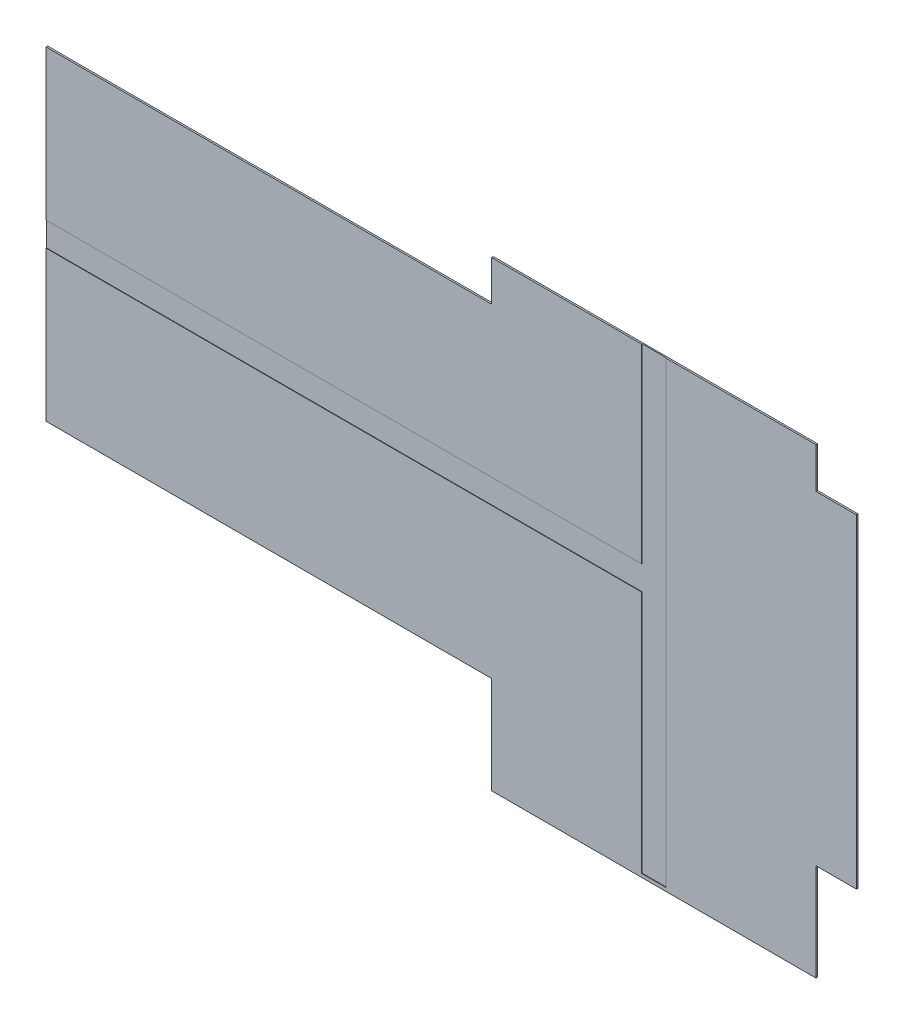
ISO-10303-21;
HEADER;
FILE_DESCRIPTION(('STEP AP214'),'2;1');
FILE_NAME('part.step','',(''),(''),'','','');
FILE_SCHEMA(('AUTOMOTIVE_DESIGN { 1 0 10303 214 1 1 1 1 }'));
ENDSEC;
DATA;
#1=APPLICATION_CONTEXT('core data for automotive mechanical design processes');
#2=APPLICATION_PROTOCOL_DEFINITION('international standard','automotive_design',2000,#1);
#3=PRODUCT_CONTEXT('',#1,'mechanical');
#4=PRODUCT('Part','Part','',(#3));
#5=PRODUCT_RELATED_PRODUCT_CATEGORY('part','',(#4));
#6=PRODUCT_DEFINITION_FORMATION('','',#4);
#7=PRODUCT_DEFINITION_CONTEXT('part definition',#1,'design');
#8=PRODUCT_DEFINITION('design','',#6,#7);
#9=PRODUCT_DEFINITION_SHAPE('','',#8);
#10=(LENGTH_UNIT() NAMED_UNIT(*) SI_UNIT(.MILLI.,.METRE.));
#11=(NAMED_UNIT(*) PLANE_ANGLE_UNIT() SI_UNIT($,.RADIAN.));
#12=(NAMED_UNIT(*) SI_UNIT($,.STERADIAN.) SOLID_ANGLE_UNIT());
#13=UNCERTAINTY_MEASURE_WITH_UNIT(LENGTH_MEASURE(1.E-05),#10,'distance_accuracy_value','');
#14=(GEOMETRIC_REPRESENTATION_CONTEXT(3) GLOBAL_UNCERTAINTY_ASSIGNED_CONTEXT((#13)) GLOBAL_UNIT_ASSIGNED_CONTEXT((#10,
#11,#12)) REPRESENTATION_CONTEXT('',''));
#15=CARTESIAN_POINT('',(0.,0.,0.));
#16=DIRECTION('',(0.,0.,1.));
#17=DIRECTION('',(1.,0.,0.));
#18=AXIS2_PLACEMENT_3D('',#15,#16,#17);
#19=CARTESIAN_POINT('',(0.,252.798507462687,2.));
#20=DIRECTION('',(0.,1.,0.));
#21=DIRECTION('',(0.,0.,1.));
#22=AXIS2_PLACEMENT_3D('',#19,#20,#21);
#23=PLANE('',#22);
#24=DIRECTION('',(1.,0.,0.));
#25=VECTOR('',#24,1.);
#26=CARTESIAN_POINT('',(0.,252.798507462687,1.5));
#27=LINE('',#26,#25);
#28=CARTESIAN_POINT('',(166.097732076766,252.798507462687,1.5));
#29=VERTEX_POINT('',#28);
#30=CARTESIAN_POINT('',(196.097732076766,252.798507462687,1.5));
#31=VERTEX_POINT('',#30);
#32=EDGE_CURVE('E197',#29,#31,#27,.T.);
#33=ORIENTED_EDGE('',*,*,#32,.T.);
#34=DIRECTION('',(0.,0.,1.));
#35=VECTOR('',#34,1.);
#36=CARTESIAN_POINT('',(196.097732076766,252.798507462687,2.));
#37=LINE('',#36,#35);
#38=CARTESIAN_POINT('',(196.097732076766,252.798507462687,2.));
#39=VERTEX_POINT('',#38);
#40=EDGE_CURVE('E262',#31,#39,#37,.T.);
#41=ORIENTED_EDGE('',*,*,#40,.T.);
#42=DIRECTION('',(1.,0.,0.));
#43=VECTOR('',#42,1.);
#44=CARTESIAN_POINT('',(0.,252.798507462687,2.));
#45=LINE('',#44,#43);
#46=CARTESIAN_POINT('',(381.097732076766,252.798507462687,2.));
#47=VERTEX_POINT('',#46);
#48=EDGE_CURVE('E254',#39,#47,#45,.T.);
#49=ORIENTED_EDGE('',*,*,#48,.T.);
#50=DIRECTION('',(0.,0.,-1.));
#51=VECTOR('',#50,1.);
#52=CARTESIAN_POINT('',(381.097732076766,252.798507462687,2.));
#53=LINE('',#52,#51);
#54=CARTESIAN_POINT('',(381.097732076766,252.798507462687,0.));
#55=VERTEX_POINT('',#54);
#56=EDGE_CURVE('E235',#47,#55,#53,.T.);
#57=ORIENTED_EDGE('',*,*,#56,.T.);
#58=DIRECTION('',(1.,0.,0.));
#59=VECTOR('',#58,1.);
#60=CARTESIAN_POINT('',(0.,252.798507462687,0.));
#61=LINE('',#60,#59);
#62=CARTESIAN_POINT('',(-18.9022679232337,252.798507462687,0.));
#63=VERTEX_POINT('',#62);
#64=EDGE_CURVE('E209',#63,#55,#61,.T.);
#65=ORIENTED_EDGE('',*,*,#64,.F.);
#66=DIRECTION('',(0.,0.,-1.));
#67=VECTOR('',#66,1.);
#68=CARTESIAN_POINT('',(-18.9022679232337,252.798507462687,2.));
#69=LINE('',#68,#67);
#70=CARTESIAN_POINT('',(-18.9022679232337,252.798507462687,2.));
#71=VERTEX_POINT('',#70);
#72=EDGE_CURVE('E233',#71,#63,#69,.T.);
#73=ORIENTED_EDGE('',*,*,#72,.F.);
#74=CARTESIAN_POINT('',(166.097732076766,252.798507462687,2.));
#75=VERTEX_POINT('',#74);
#76=EDGE_CURVE('E292',#71,#75,#45,.T.);
#77=ORIENTED_EDGE('',*,*,#76,.T.);
#78=DIRECTION('',(0.,0.,1.));
#79=VECTOR('',#78,1.);
#80=CARTESIAN_POINT('',(166.097732076766,252.798507462687,2.));
#81=LINE('',#80,#79);
#82=EDGE_CURVE('E272',#29,#75,#81,.T.);
#83=ORIENTED_EDGE('',*,*,#82,.F.);
#84=EDGE_LOOP('',(#33,#41,#49,#57,#65,#73,#77,#83));
#85=FACE_BOUND('',#84,.T.);
#86=ADVANCED_FACE('F61',(#85),#23,.T.);
#87=CARTESIAN_POINT('',(0.,0.,2.));
#88=DIRECTION('',(0.,0.,1.));
#89=DIRECTION('',(1.,0.,0.));
#90=AXIS2_PLACEMENT_3D('',#87,#88,#89);
#91=PLANE('',#90);
#92=DIRECTION('',(0.,-1.,0.));
#93=VECTOR('',#92,1.);
#94=CARTESIAN_POINT('',(-568.902267923234,-1.10808490633306E-13,2.));
#95=LINE('',#94,#93);
#96=CARTESIAN_POINT('',(-568.902267923234,202.798507462687,2.));
#97=VERTEX_POINT('',#96);
#98=CARTESIAN_POINT('',(-568.902267923234,17.7985074626865,2.));
#99=VERTEX_POINT('',#98);
#100=EDGE_CURVE('E175',#97,#99,#95,.T.);
#101=ORIENTED_EDGE('',*,*,#100,.T.);
#102=DIRECTION('',(1.,0.,0.));
#103=VECTOR('',#102,1.);
#104=CARTESIAN_POINT('',(0.,17.7985074626865,2.));
#105=LINE('',#104,#103);
#106=CARTESIAN_POINT('',(166.097732076766,17.7985074626865,2.));
#107=VERTEX_POINT('',#106);
#108=EDGE_CURVE('E309',#99,#107,#105,.T.);
#109=ORIENTED_EDGE('',*,*,#108,.T.);
#110=DIRECTION('',(0.,-1.,0.));
#111=VECTOR('',#110,1.);
#112=CARTESIAN_POINT('',(166.097732076766,0.,2.));
#113=LINE('',#112,#111);
#114=EDGE_CURVE('E12',#75,#107,#113,.T.);
#115=ORIENTED_EDGE('',*,*,#114,.F.);
#116=ORIENTED_EDGE('',*,*,#76,.F.);
#117=DIRECTION('',(0.,-1.,0.));
#118=VECTOR('',#117,1.);
#119=CARTESIAN_POINT('',(-18.9022679232336,0.,2.));
#120=LINE('',#119,#118);
#121=CARTESIAN_POINT('',(-18.9022679232337,202.798507462687,2.));
#122=VERTEX_POINT('',#121);
#123=EDGE_CURVE('E295',#71,#122,#120,.T.);
#124=ORIENTED_EDGE('',*,*,#123,.T.);
#125=DIRECTION('',(1.,0.,0.));
#126=VECTOR('',#125,1.);
#127=CARTESIAN_POINT('',(0.,202.798507462687,2.));
#128=LINE('',#127,#126);
#129=EDGE_CURVE('E297',#97,#122,#128,.T.);
#130=ORIENTED_EDGE('',*,*,#129,.F.);
#131=EDGE_LOOP('',(#101,#109,#115,#116,#124,#130));
#132=FACE_BOUND('',#131,.T.);
#133=ADVANCED_FACE('F305',(#132),#91,.T.);
#134=CARTESIAN_POINT('',(381.097732076766,1.7629311532669E-13,2.));
#135=DIRECTION('',(1.,0.,0.));
#136=DIRECTION('',(0.,1.,0.));
#137=AXIS2_PLACEMENT_3D('',#134,#135,#136);
#138=PLANE('',#137);
#139=DIRECTION('',(0.,-1.,0.));
#140=VECTOR('',#139,1.);
#141=CARTESIAN_POINT('',(381.097732076766,1.7629311532669E-13,0.));
#142=LINE('',#141,#140);
#143=CARTESIAN_POINT('',(381.097732076766,-197.201492537313,0.));
#144=VERTEX_POINT('',#143);
#145=CARTESIAN_POINT('',(381.097732076766,-317.201492537313,0.));
#146=VERTEX_POINT('',#145);
#147=EDGE_CURVE('E193',#144,#146,#142,.T.);
#148=ORIENTED_EDGE('',*,*,#147,.F.);
#149=DIRECTION('',(0.,0.,-1.));
#150=VECTOR('',#149,1.);
#151=CARTESIAN_POINT('',(381.097732076766,-197.201492537313,2.));
#152=LINE('',#151,#150);
#153=CARTESIAN_POINT('',(381.097732076766,-197.201492537313,2.));
#154=VERTEX_POINT('',#153);
#155=EDGE_CURVE('E136',#154,#144,#152,.T.);
#156=ORIENTED_EDGE('',*,*,#155,.F.);
#157=DIRECTION('',(0.,-1.,0.));
#158=VECTOR('',#157,1.);
#159=CARTESIAN_POINT('',(381.097732076766,1.7629311532669E-13,2.));
#160=LINE('',#159,#158);
#161=CARTESIAN_POINT('',(381.097732076766,-317.201492537313,2.));
#162=VERTEX_POINT('',#161);
#163=EDGE_CURVE('E225',#154,#162,#160,.T.);
#164=ORIENTED_EDGE('',*,*,#163,.T.);
#165=DIRECTION('',(0.,0.,-1.));
#166=VECTOR('',#165,1.);
#167=CARTESIAN_POINT('',(381.097732076766,-317.201492537313,2.));
#168=LINE('',#167,#166);
#169=EDGE_CURVE('E131',#162,#146,#168,.T.);
#170=ORIENTED_EDGE('',*,*,#169,.T.);
#171=EDGE_LOOP('',(#148,#156,#164,#170));
#172=FACE_BOUND('',#171,.T.);
#173=ADVANCED_FACE('F63',(#172),#138,.T.);
#174=CARTESIAN_POINT('',(0.,-197.201492537313,2.));
#175=DIRECTION('',(0.,1.,0.));
#176=DIRECTION('',(0.,0.,1.));
#177=AXIS2_PLACEMENT_3D('',#174,#175,#176);
#178=PLANE('',#177);
#179=DIRECTION('',(1.,0.,0.));
#180=VECTOR('',#179,1.);
#181=CARTESIAN_POINT('',(0.,-197.201492537313,0.));
#182=LINE('',#181,#180);
#183=CARTESIAN_POINT('',(431.097732076766,-197.201492537313,0.));
#184=VERTEX_POINT('',#183);
#185=EDGE_CURVE('E196',#144,#184,#182,.T.);
#186=ORIENTED_EDGE('',*,*,#185,.T.);
#187=DIRECTION('',(0.,0.,-1.));
#188=VECTOR('',#187,1.);
#189=CARTESIAN_POINT('',(431.097732076766,-197.201492537313,2.));
#190=LINE('',#189,#188);
#191=CARTESIAN_POINT('',(431.097732076766,-197.201492537313,2.));
#192=VERTEX_POINT('',#191);
#193=EDGE_CURVE('E241',#192,#184,#190,.T.);
#194=ORIENTED_EDGE('',*,*,#193,.F.);
#195=DIRECTION('',(1.,0.,0.));
#196=VECTOR('',#195,1.);
#197=CARTESIAN_POINT('',(0.,-197.201492537313,2.));
#198=LINE('',#197,#196);
#199=EDGE_CURVE('E281',#154,#192,#198,.T.);
#200=ORIENTED_EDGE('',*,*,#199,.F.);
#201=ORIENTED_EDGE('',*,*,#155,.T.);
#202=EDGE_LOOP('',(#186,#194,#200,#201));
#203=FACE_BOUND('',#202,.T.);
#204=ADVANCED_FACE('F377',(#203),#178,.F.);
#205=CARTESIAN_POINT('',(431.097732076766,0.,2.));
#206=DIRECTION('',(1.,0.,0.));
#207=DIRECTION('',(0.,1.,0.));
#208=AXIS2_PLACEMENT_3D('',#205,#206,#207);
#209=PLANE('',#208);
#210=DIRECTION('',(0.,-1.,0.));
#211=VECTOR('',#210,1.);
#212=CARTESIAN_POINT('',(431.097732076766,0.,0.));
#213=LINE('',#212,#211);
#214=CARTESIAN_POINT('',(431.097732076766,202.798507462687,0.));
#215=VERTEX_POINT('',#214);
#216=EDGE_CURVE('E200',#215,#184,#213,.T.);
#217=ORIENTED_EDGE('',*,*,#216,.F.);
#218=DIRECTION('',(0.,0.,-1.));
#219=VECTOR('',#218,1.);
#220=CARTESIAN_POINT('',(431.097732076766,202.798507462687,2.));
#221=LINE('',#220,#219);
#222=CARTESIAN_POINT('',(431.097732076766,202.798507462687,2.));
#223=VERTEX_POINT('',#222);
#224=EDGE_CURVE('E239',#223,#215,#221,.T.);
#225=ORIENTED_EDGE('',*,*,#224,.F.);
#226=DIRECTION('',(0.,-1.,0.));
#227=VECTOR('',#226,1.);
#228=CARTESIAN_POINT('',(431.097732076766,0.,2.));
#229=LINE('',#228,#227);
#230=EDGE_CURVE('E283',#223,#192,#229,.T.);
#231=ORIENTED_EDGE('',*,*,#230,.T.);
#232=ORIENTED_EDGE('',*,*,#193,.T.);
#233=EDGE_LOOP('',(#217,#225,#231,#232));
#234=FACE_BOUND('',#233,.T.);
#235=ADVANCED_FACE('F380',(#234),#209,.T.);
#236=CARTESIAN_POINT('',(0.,202.798507462687,2.));
#237=DIRECTION('',(0.,1.,0.));
#238=DIRECTION('',(0.,0.,1.));
#239=AXIS2_PLACEMENT_3D('',#236,#237,#238);
#240=PLANE('',#239);
#241=DIRECTION('',(1.,0.,0.));
#242=VECTOR('',#241,1.);
#243=CARTESIAN_POINT('',(0.,202.798507462687,0.));
#244=LINE('',#243,#242);
#245=CARTESIAN_POINT('',(381.097732076766,202.798507462687,0.));
#246=VERTEX_POINT('',#245);
#247=EDGE_CURVE('E203',#246,#215,#244,.T.);
#248=ORIENTED_EDGE('',*,*,#247,.F.);
#249=DIRECTION('',(0.,0.,-1.));
#250=VECTOR('',#249,1.);
#251=CARTESIAN_POINT('',(381.097732076766,202.798507462687,2.));
#252=LINE('',#251,#250);
#253=CARTESIAN_POINT('',(381.097732076766,202.798507462687,2.));
#254=VERTEX_POINT('',#253);
#255=EDGE_CURVE('E237',#254,#246,#252,.T.);
#256=ORIENTED_EDGE('',*,*,#255,.F.);
#257=DIRECTION('',(1.,0.,0.));
#258=VECTOR('',#257,1.);
#259=CARTESIAN_POINT('',(0.,202.798507462687,2.));
#260=LINE('',#259,#258);
#261=EDGE_CURVE('E286',#254,#223,#260,.T.);
#262=ORIENTED_EDGE('',*,*,#261,.T.);
#263=ORIENTED_EDGE('',*,*,#224,.T.);
#264=EDGE_LOOP('',(#248,#256,#262,#263));
#265=FACE_BOUND('',#264,.T.);
#266=ADVANCED_FACE('F383',(#265),#240,.T.);
#267=CARTESIAN_POINT('',(381.097732076766,0.,2.));
#268=DIRECTION('',(1.,0.,0.));
#269=DIRECTION('',(0.,0.,-1.));
#270=AXIS2_PLACEMENT_3D('',#267,#268,#269);
#271=PLANE('',#270);
#272=DIRECTION('',(0.,-1.,0.));
#273=VECTOR('',#272,1.);
#274=CARTESIAN_POINT('',(381.097732076766,0.,0.));
#275=LINE('',#274,#273);
#276=EDGE_CURVE('E206',#55,#246,#275,.T.);
#277=ORIENTED_EDGE('',*,*,#276,.F.);
#278=ORIENTED_EDGE('',*,*,#56,.F.);
#279=DIRECTION('',(0.,-1.,0.));
#280=VECTOR('',#279,1.);
#281=CARTESIAN_POINT('',(381.097732076766,0.,2.));
#282=LINE('',#281,#280);
#283=EDGE_CURVE('E289',#47,#254,#282,.T.);
#284=ORIENTED_EDGE('',*,*,#283,.T.);
#285=ORIENTED_EDGE('',*,*,#255,.T.);
#286=EDGE_LOOP('',(#277,#278,#284,#285));
#287=FACE_BOUND('',#286,.T.);
#288=ADVANCED_FACE('F386',(#287),#271,.T.);
#289=CARTESIAN_POINT('',(-18.9022679232336,0.,2.));
#290=DIRECTION('',(1.,0.,0.));
#291=DIRECTION('',(0.,1.,0.));
#292=AXIS2_PLACEMENT_3D('',#289,#290,#291);
#293=PLANE('',#292);
#294=DIRECTION('',(0.,-1.,0.));
#295=VECTOR('',#294,1.);
#296=CARTESIAN_POINT('',(-18.9022679232336,0.,0.));
#297=LINE('',#296,#295);
#298=CARTESIAN_POINT('',(-18.9022679232337,202.798507462687,0.));
#299=VERTEX_POINT('',#298);
#300=EDGE_CURVE('E212',#63,#299,#297,.T.);
#301=ORIENTED_EDGE('',*,*,#300,.T.);
#302=DIRECTION('',(0.,0.,-1.));
#303=VECTOR('',#302,1.);
#304=CARTESIAN_POINT('',(-18.9022679232337,202.798507462687,2.));
#305=LINE('',#304,#303);
#306=EDGE_CURVE('E231',#122,#299,#305,.T.);
#307=ORIENTED_EDGE('',*,*,#306,.F.);
#308=ORIENTED_EDGE('',*,*,#123,.F.);
#309=ORIENTED_EDGE('',*,*,#72,.T.);
#310=EDGE_LOOP('',(#301,#307,#308,#309));
#311=FACE_BOUND('',#310,.T.);
#312=ADVANCED_FACE('F392',(#311),#293,.F.);
#313=CARTESIAN_POINT('',(0.,202.798507462687,2.));
#314=DIRECTION('',(0.,1.,0.));
#315=DIRECTION('',(0.,0.,1.));
#316=AXIS2_PLACEMENT_3D('',#313,#314,#315);
#317=PLANE('',#316);
#318=DIRECTION('',(1.,0.,0.));
#319=VECTOR('',#318,1.);
#320=CARTESIAN_POINT('',(0.,202.798507462687,0.));
#321=LINE('',#320,#319);
#322=CARTESIAN_POINT('',(-568.902267923234,202.798507462687,0.));
#323=VERTEX_POINT('',#322);
#324=EDGE_CURVE('E215',#323,#299,#321,.T.);
#325=ORIENTED_EDGE('',*,*,#324,.F.);
#326=DIRECTION('',(0.,0.,-1.));
#327=VECTOR('',#326,1.);
#328=CARTESIAN_POINT('',(-568.902267923234,202.798507462687,2.));
#329=LINE('',#328,#327);
#330=EDGE_CURVE('E229',#97,#323,#329,.T.);
#331=ORIENTED_EDGE('',*,*,#330,.F.);
#332=ORIENTED_EDGE('',*,*,#129,.T.);
#333=ORIENTED_EDGE('',*,*,#306,.T.);
#334=EDGE_LOOP('',(#325,#331,#332,#333));
#335=FACE_BOUND('',#334,.T.);
#336=ADVANCED_FACE('F553',(#335),#317,.T.);
#337=CARTESIAN_POINT('',(-568.902267923234,-1.10808490633306E-13,2.));
#338=DIRECTION('',(1.,0.,0.));
#339=DIRECTION('',(0.,1.,0.));
#340=AXIS2_PLACEMENT_3D('',#337,#338,#339);
#341=PLANE('',#340);
#342=CARTESIAN_POINT('',(-568.902267923234,-12.2014925373135,2.));
#343=VERTEX_POINT('',#342);
#344=CARTESIAN_POINT('',(-568.902267923234,-197.201492537313,2.));
#345=VERTEX_POINT('',#344);
#346=EDGE_CURVE('E171',#343,#345,#95,.T.);
#347=ORIENTED_EDGE('',*,*,#346,.F.);
#348=DIRECTION('',(0.,0.,1.));
#349=VECTOR('',#348,1.);
#350=CARTESIAN_POINT('',(-568.902267923234,-12.2014925373135,1.5));
#351=LINE('',#350,#349);
#352=CARTESIAN_POINT('',(-568.902267923234,-12.2014925373135,1.5));
#353=VERTEX_POINT('',#352);
#354=EDGE_CURVE('E326',#353,#343,#351,.T.);
#355=ORIENTED_EDGE('',*,*,#354,.F.);
#356=DIRECTION('',(0.,-1.,0.));
#357=VECTOR('',#356,1.);
#358=CARTESIAN_POINT('',(-568.902267923234,-1.10808490633306E-13,1.5));
#359=LINE('',#358,#357);
#360=CARTESIAN_POINT('',(-568.902267923234,17.7985074626865,1.5));
#361=VERTEX_POINT('',#360);
#362=EDGE_CURVE('E322',#361,#353,#359,.T.);
#363=ORIENTED_EDGE('',*,*,#362,.F.);
#364=DIRECTION('',(0.,0.,1.));
#365=VECTOR('',#364,1.);
#366=CARTESIAN_POINT('',(-568.902267923234,17.7985074626865,1.5));
#367=LINE('',#366,#365);
#368=EDGE_CURVE('E318',#361,#99,#367,.T.);
#369=ORIENTED_EDGE('',*,*,#368,.T.);
#370=ORIENTED_EDGE('',*,*,#100,.F.);
#371=ORIENTED_EDGE('',*,*,#330,.T.);
#372=DIRECTION('',(0.,-1.,0.));
#373=VECTOR('',#372,1.);
#374=CARTESIAN_POINT('',(-568.902267923234,-1.10808490633306E-13,0.));
#375=LINE('',#374,#373);
#376=CARTESIAN_POINT('',(-568.902267923234,-197.201492537313,0.));
#377=VERTEX_POINT('',#376);
#378=EDGE_CURVE('E218',#323,#377,#375,.T.);
#379=ORIENTED_EDGE('',*,*,#378,.T.);
#380=DIRECTION('',(0.,0.,-1.));
#381=VECTOR('',#380,1.);
#382=CARTESIAN_POINT('',(-568.902267923234,-197.201492537313,2.));
#383=LINE('',#382,#381);
#384=EDGE_CURVE('E185',#345,#377,#383,.T.);
#385=ORIENTED_EDGE('',*,*,#384,.F.);
#386=EDGE_LOOP('',(#347,#355,#363,#369,#370,#371,#379,#385));
#387=FACE_BOUND('',#386,.T.);
#388=ADVANCED_FACE('F314',(#387),#341,.F.);
#389=CARTESIAN_POINT('',(0.,-197.201492537313,2.));
#390=DIRECTION('',(0.,1.,0.));
#391=DIRECTION('',(0.,0.,1.));
#392=AXIS2_PLACEMENT_3D('',#389,#390,#391);
#393=PLANE('',#392);
#394=DIRECTION('',(1.,0.,0.));
#395=VECTOR('',#394,1.);
#396=CARTESIAN_POINT('',(0.,-197.201492537313,0.));
#397=LINE('',#396,#395);
#398=CARTESIAN_POINT('',(-18.9022679232336,-197.201492537313,0.));
#399=VERTEX_POINT('',#398);
#400=EDGE_CURVE('E181',#377,#399,#397,.T.);
#401=ORIENTED_EDGE('',*,*,#400,.T.);
#402=DIRECTION('',(0.,0.,-1.));
#403=VECTOR('',#402,1.);
#404=CARTESIAN_POINT('',(-18.9022679232336,-197.201492537313,2.));
#405=LINE('',#404,#403);
#406=CARTESIAN_POINT('',(-18.9022679232336,-197.201492537313,2.));
#407=VERTEX_POINT('',#406);
#408=EDGE_CURVE('E178',#407,#399,#405,.T.);
#409=ORIENTED_EDGE('',*,*,#408,.F.);
#410=DIRECTION('',(1.,0.,0.));
#411=VECTOR('',#410,1.);
#412=CARTESIAN_POINT('',(0.,-197.201492537313,2.));
#413=LINE('',#412,#411);
#414=EDGE_CURVE('E165',#345,#407,#413,.T.);
#415=ORIENTED_EDGE('',*,*,#414,.F.);
#416=ORIENTED_EDGE('',*,*,#384,.T.);
#417=EDGE_LOOP('',(#401,#409,#415,#416));
#418=FACE_BOUND('',#417,.T.);
#419=ADVANCED_FACE('F179',(#418),#393,.F.);
#420=CARTESIAN_POINT('',(-18.9022679232335,0.,2.));
#421=DIRECTION('',(-1.,0.,0.));
#422=DIRECTION('',(0.,-1.,0.));
#423=AXIS2_PLACEMENT_3D('',#420,#421,#422);
#424=PLANE('',#423);
#425=DIRECTION('',(0.,1.,0.));
#426=VECTOR('',#425,1.);
#427=CARTESIAN_POINT('',(-18.9022679232335,0.,0.));
#428=LINE('',#427,#426);
#429=CARTESIAN_POINT('',(-18.9022679232336,-317.201492537313,0.));
#430=VERTEX_POINT('',#429);
#431=EDGE_CURVE('E221',#430,#399,#428,.T.);
#432=ORIENTED_EDGE('',*,*,#431,.F.);
#433=DIRECTION('',(0.,0.,-1.));
#434=VECTOR('',#433,1.);
#435=CARTESIAN_POINT('',(-18.9022679232336,-317.201492537313,2.));
#436=LINE('',#435,#434);
#437=CARTESIAN_POINT('',(-18.9022679232336,-317.201492537313,2.));
#438=VERTEX_POINT('',#437);
#439=EDGE_CURVE('E186',#438,#430,#436,.T.);
#440=ORIENTED_EDGE('',*,*,#439,.F.);
#441=DIRECTION('',(0.,1.,0.));
#442=VECTOR('',#441,1.);
#443=CARTESIAN_POINT('',(-18.9022679232335,0.,2.));
#444=LINE('',#443,#442);
#445=EDGE_CURVE('E169',#438,#407,#444,.T.);
#446=ORIENTED_EDGE('',*,*,#445,.T.);
#447=ORIENTED_EDGE('',*,*,#408,.T.);
#448=EDGE_LOOP('',(#432,#440,#446,#447));
#449=FACE_BOUND('',#448,.T.);
#450=ADVANCED_FACE('F188',(#449),#424,.T.);
#451=CARTESIAN_POINT('',(0.,-317.201492537313,2.));
#452=DIRECTION('',(0.,1.,0.));
#453=DIRECTION('',(0.,0.,1.));
#454=AXIS2_PLACEMENT_3D('',#451,#452,#453);
#455=PLANE('',#454);
#456=DIRECTION('',(1.,0.,0.));
#457=VECTOR('',#456,1.);
#458=CARTESIAN_POINT('',(0.,-317.201492537313,0.));
#459=LINE('',#458,#457);
#460=EDGE_CURVE('E223',#430,#146,#459,.T.);
#461=ORIENTED_EDGE('',*,*,#460,.T.);
#462=ORIENTED_EDGE('',*,*,#169,.F.);
#463=DIRECTION('',(1.,0.,0.));
#464=VECTOR('',#463,1.);
#465=CARTESIAN_POINT('',(0.,-317.201492537313,2.));
#466=LINE('',#465,#464);
#467=EDGE_CURVE('E85',#438,#162,#466,.T.);
#468=ORIENTED_EDGE('',*,*,#467,.F.);
#469=ORIENTED_EDGE('',*,*,#439,.T.);
#470=EDGE_LOOP('',(#461,#462,#468,#469));
#471=FACE_BOUND('',#470,.T.);
#472=ADVANCED_FACE('F372',(#471),#455,.F.);
#473=DIRECTION('',(1.,0.,0.));
#474=VECTOR('',#473,1.);
#475=CARTESIAN_POINT('',(0.,-12.2014925373135,2.));
#476=LINE('',#475,#474);
#477=CARTESIAN_POINT('',(166.097732076766,-12.2014925373135,2.));
#478=VERTEX_POINT('',#477);
#479=EDGE_CURVE('E76',#343,#478,#476,.T.);
#480=ORIENTED_EDGE('',*,*,#479,.F.);
#481=ORIENTED_EDGE('',*,*,#346,.T.);
#482=ORIENTED_EDGE('',*,*,#414,.T.);
#483=ORIENTED_EDGE('',*,*,#445,.F.);
#484=ORIENTED_EDGE('',*,*,#467,.T.);
#485=ORIENTED_EDGE('',*,*,#163,.F.);
#486=ORIENTED_EDGE('',*,*,#199,.T.);
#487=ORIENTED_EDGE('',*,*,#230,.F.);
#488=ORIENTED_EDGE('',*,*,#261,.F.);
#489=ORIENTED_EDGE('',*,*,#283,.F.);
#490=ORIENTED_EDGE('',*,*,#48,.F.);
#491=DIRECTION('',(0.,-1.,0.));
#492=VECTOR('',#491,1.);
#493=CARTESIAN_POINT('',(196.097732076766,0.,2.));
#494=LINE('',#493,#492);
#495=CARTESIAN_POINT('',(196.097732076766,-312.921679908609,2.));
#496=VERTEX_POINT('',#495);
#497=EDGE_CURVE('E69',#39,#496,#494,.T.);
#498=ORIENTED_EDGE('',*,*,#497,.T.);
#499=DIRECTION('',(1.,0.,0.));
#500=VECTOR('',#499,1.);
#501=CARTESIAN_POINT('',(166.097732076766,-312.921679908609,2.));
#502=LINE('',#501,#500);
#503=CARTESIAN_POINT('',(166.097732076766,-312.921679908609,2.));
#504=VERTEX_POINT('',#503);
#505=EDGE_CURVE('E251',#504,#496,#502,.T.);
#506=ORIENTED_EDGE('',*,*,#505,.F.);
#507=DIRECTION('',(0.,-1.,0.));
#508=VECTOR('',#507,1.);
#509=CARTESIAN_POINT('',(166.097732076766,253.906798238422,2.));
#510=LINE('',#509,#508);
#511=EDGE_CURVE('E338',#478,#504,#510,.T.);
#512=ORIENTED_EDGE('',*,*,#511,.F.);
#513=EDGE_LOOP('',(#480,#481,#482,#483,#484,#485,#486,#487,#488,#489,#490,#498,#506,#512));
#514=FACE_BOUND('',#513,.T.);
#515=ADVANCED_FACE('F167',(#514),#91,.T.);
#516=CARTESIAN_POINT('',(0.,0.,0.));
#517=DIRECTION('',(0.,0.,1.));
#518=DIRECTION('',(1.,0.,0.));
#519=AXIS2_PLACEMENT_3D('',#516,#517,#518);
#520=PLANE('',#519);
#521=ORIENTED_EDGE('',*,*,#147,.T.);
#522=ORIENTED_EDGE('',*,*,#460,.F.);
#523=ORIENTED_EDGE('',*,*,#431,.T.);
#524=ORIENTED_EDGE('',*,*,#400,.F.);
#525=ORIENTED_EDGE('',*,*,#378,.F.);
#526=ORIENTED_EDGE('',*,*,#324,.T.);
#527=ORIENTED_EDGE('',*,*,#300,.F.);
#528=ORIENTED_EDGE('',*,*,#64,.T.);
#529=ORIENTED_EDGE('',*,*,#276,.T.);
#530=ORIENTED_EDGE('',*,*,#247,.T.);
#531=ORIENTED_EDGE('',*,*,#216,.T.);
#532=ORIENTED_EDGE('',*,*,#185,.F.);
#533=EDGE_LOOP('',(#521,#522,#523,#524,#525,#526,#527,#528,#529,#530,#531,#532));
#534=FACE_BOUND('',#533,.T.);
#535=ADVANCED_FACE('F367',(#534),#520,.F.);
#536=CARTESIAN_POINT('',(0.,-12.2014925373135,1.5));
#537=DIRECTION('',(0.,-1.,0.));
#538=DIRECTION('',(0.,0.,-1.));
#539=AXIS2_PLACEMENT_3D('',#536,#537,#538);
#540=PLANE('',#539);
#541=ORIENTED_EDGE('',*,*,#479,.T.);
#542=DIRECTION('',(0.,0.,1.));
#543=VECTOR('',#542,1.);
#544=CARTESIAN_POINT('',(166.097732076766,-12.2014925373135,1.5));
#545=LINE('',#544,#543);
#546=CARTESIAN_POINT('',(166.097732076766,-12.2014925373135,1.5));
#547=VERTEX_POINT('',#546);
#548=EDGE_CURVE('E276',#547,#478,#545,.T.);
#549=ORIENTED_EDGE('',*,*,#548,.F.);
#550=DIRECTION('',(1.,0.,0.));
#551=VECTOR('',#550,1.);
#552=CARTESIAN_POINT('',(0.,-12.2014925373135,1.5));
#553=LINE('',#552,#551);
#554=EDGE_CURVE('E331',#353,#547,#553,.T.);
#555=ORIENTED_EDGE('',*,*,#554,.F.);
#556=ORIENTED_EDGE('',*,*,#354,.T.);
#557=EDGE_LOOP('',(#541,#549,#555,#556));
#558=FACE_BOUND('',#557,.T.);
#559=ADVANCED_FACE('F415',(#558),#540,.F.);
#560=CARTESIAN_POINT('',(0.,17.7985074626865,1.5));
#561=DIRECTION('',(0.,-1.,0.));
#562=DIRECTION('',(0.,0.,-1.));
#563=AXIS2_PLACEMENT_3D('',#560,#561,#562);
#564=PLANE('',#563);
#565=ORIENTED_EDGE('',*,*,#108,.F.);
#566=ORIENTED_EDGE('',*,*,#368,.F.);
#567=DIRECTION('',(1.,0.,0.));
#568=VECTOR('',#567,1.);
#569=CARTESIAN_POINT('',(0.,17.7985074626865,1.5));
#570=LINE('',#569,#568);
#571=CARTESIAN_POINT('',(166.097732076766,17.7985074626865,1.5));
#572=VERTEX_POINT('',#571);
#573=EDGE_CURVE('E351',#361,#572,#570,.T.);
#574=ORIENTED_EDGE('',*,*,#573,.T.);
#575=DIRECTION('',(0.,0.,1.));
#576=VECTOR('',#575,1.);
#577=CARTESIAN_POINT('',(166.097732076766,17.7985074626865,1.5));
#578=LINE('',#577,#576);
#579=EDGE_CURVE('E327',#572,#107,#578,.T.);
#580=ORIENTED_EDGE('',*,*,#579,.T.);
#581=EDGE_LOOP('',(#565,#566,#574,#580));
#582=FACE_BOUND('',#581,.T.);
#583=ADVANCED_FACE('F413',(#582),#564,.T.);
#584=CARTESIAN_POINT('',(0.,0.,1.5));
#585=DIRECTION('',(0.,0.,1.));
#586=DIRECTION('',(1.,0.,0.));
#587=AXIS2_PLACEMENT_3D('',#584,#585,#586);
#588=PLANE('',#587);
#589=DIRECTION('',(0.,-1.,0.));
#590=VECTOR('',#589,1.);
#591=CARTESIAN_POINT('',(166.097732076766,253.906798238422,1.5));
#592=LINE('',#591,#590);
#593=EDGE_CURVE('E342',#29,#572,#592,.T.);
#594=ORIENTED_EDGE('',*,*,#593,.T.);
#595=ORIENTED_EDGE('',*,*,#573,.F.);
#596=ORIENTED_EDGE('',*,*,#362,.T.);
#597=ORIENTED_EDGE('',*,*,#554,.T.);
#598=CARTESIAN_POINT('',(166.097732076766,-312.921679908609,1.5));
#599=VERTEX_POINT('',#598);
#600=EDGE_CURVE('E341',#547,#599,#592,.T.);
#601=ORIENTED_EDGE('',*,*,#600,.T.);
#602=DIRECTION('',(1.,0.,0.));
#603=VECTOR('',#602,1.);
#604=CARTESIAN_POINT('',(166.097732076766,-312.921679908609,1.5));
#605=LINE('',#604,#603);
#606=CARTESIAN_POINT('',(196.097732076766,-312.921679908609,1.5));
#607=VERTEX_POINT('',#606);
#608=EDGE_CURVE('E337',#599,#607,#605,.T.);
#609=ORIENTED_EDGE('',*,*,#608,.T.);
#610=DIRECTION('',(0.,-1.,0.));
#611=VECTOR('',#610,1.);
#612=CARTESIAN_POINT('',(196.097732076766,253.906798238422,1.5));
#613=LINE('',#612,#611);
#614=EDGE_CURVE('E335',#31,#607,#613,.T.);
#615=ORIENTED_EDGE('',*,*,#614,.F.);
#616=ORIENTED_EDGE('',*,*,#32,.F.);
#617=EDGE_LOOP('',(#594,#595,#596,#597,#601,#609,#615,#616));
#618=FACE_BOUND('',#617,.T.);
#619=ADVANCED_FACE('F411',(#618),#588,.T.);
#620=CARTESIAN_POINT('',(196.097732076766,253.906798238422,1.5));
#621=DIRECTION('',(-1.,0.,0.));
#622=DIRECTION('',(0.,-1.,0.));
#623=AXIS2_PLACEMENT_3D('',#620,#621,#622);
#624=PLANE('',#623);
#625=ORIENTED_EDGE('',*,*,#614,.T.);
#626=DIRECTION('',(0.,0.,1.));
#627=VECTOR('',#626,1.);
#628=CARTESIAN_POINT('',(196.097732076766,-312.921679908609,1.5));
#629=LINE('',#628,#627);
#630=EDGE_CURVE('E265',#607,#496,#629,.T.);
#631=ORIENTED_EDGE('',*,*,#630,.T.);
#632=ORIENTED_EDGE('',*,*,#497,.F.);
#633=ORIENTED_EDGE('',*,*,#40,.F.);
#634=EDGE_LOOP('',(#625,#631,#632,#633));
#635=FACE_BOUND('',#634,.T.);
#636=ADVANCED_FACE('F261',(#635),#624,.T.);
#637=CARTESIAN_POINT('',(166.097732076766,-312.921679908609,1.5));
#638=DIRECTION('',(0.,-1.,0.));
#639=DIRECTION('',(0.,0.,-1.));
#640=AXIS2_PLACEMENT_3D('',#637,#638,#639);
#641=PLANE('',#640);
#642=ORIENTED_EDGE('',*,*,#505,.T.);
#643=ORIENTED_EDGE('',*,*,#630,.F.);
#644=ORIENTED_EDGE('',*,*,#608,.F.);
#645=DIRECTION('',(0.,0.,1.));
#646=VECTOR('',#645,1.);
#647=CARTESIAN_POINT('',(166.097732076766,-312.921679908609,1.5));
#648=LINE('',#647,#646);
#649=EDGE_CURVE('E345',#599,#504,#648,.T.);
#650=ORIENTED_EDGE('',*,*,#649,.T.);
#651=EDGE_LOOP('',(#642,#643,#644,#650));
#652=FACE_BOUND('',#651,.T.);
#653=ADVANCED_FACE('F426',(#652),#641,.F.);
#654=CARTESIAN_POINT('',(166.097732076766,253.906798238422,1.5));
#655=DIRECTION('',(-1.,0.,0.));
#656=DIRECTION('',(0.,-1.,0.));
#657=AXIS2_PLACEMENT_3D('',#654,#655,#656);
#658=PLANE('',#657);
#659=ORIENTED_EDGE('',*,*,#82,.T.);
#660=ORIENTED_EDGE('',*,*,#114,.T.);
#661=ORIENTED_EDGE('',*,*,#579,.F.);
#662=ORIENTED_EDGE('',*,*,#593,.F.);
#663=EDGE_LOOP('',(#659,#660,#661,#662));
#664=FACE_BOUND('',#663,.T.);
#665=ADVANCED_FACE('F412',(#664),#658,.F.);
#666=ORIENTED_EDGE('',*,*,#548,.T.);
#667=ORIENTED_EDGE('',*,*,#511,.T.);
#668=ORIENTED_EDGE('',*,*,#649,.F.);
#669=ORIENTED_EDGE('',*,*,#600,.F.);
#670=EDGE_LOOP('',(#666,#667,#668,#669));
#671=FACE_BOUND('',#670,.T.);
#672=ADVANCED_FACE('F357',(#671),#658,.F.);
#673=CLOSED_SHELL('',(#86,#133,#173,#204,#235,#266,#288,#312,#336,#388,#419,#450,#472,#515,#535,
#559,#583,#619,#636,#653,#665,#672));
#674=MANIFOLD_SOLID_BREP('B2',#673);
#675=ADVANCED_BREP_SHAPE_REPRESENTATION('',(#18,#674),#14);
#676=SHAPE_DEFINITION_REPRESENTATION(#9,#675);
ENDSEC;
END-ISO-10303-21;
